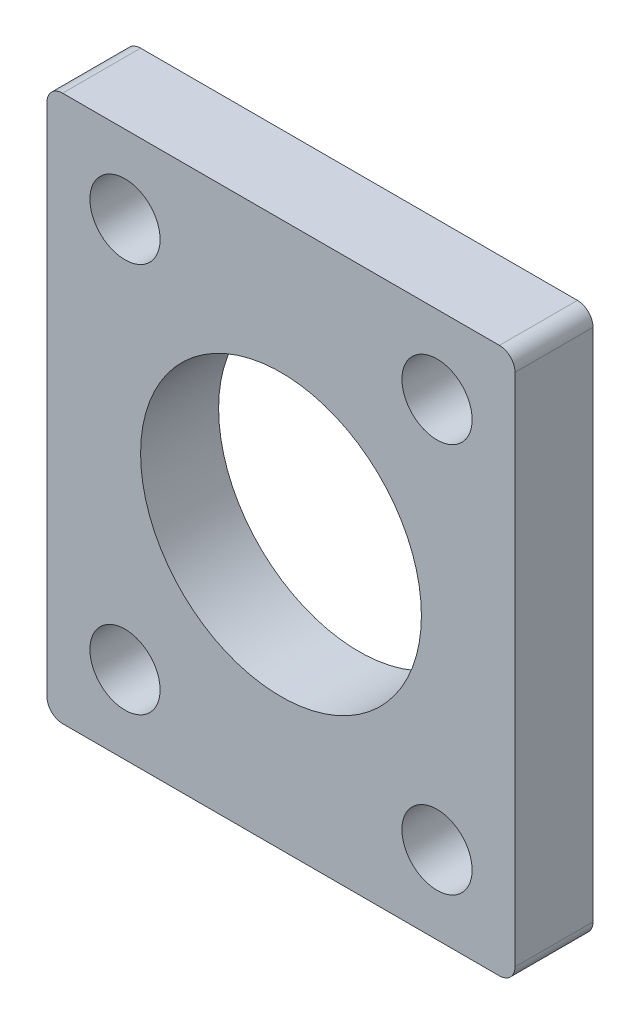
ISO-10303-21;
HEADER;
FILE_DESCRIPTION(('STEP AP214'),'2;1');
FILE_NAME('part.step','',(''),(''),'','','');
FILE_SCHEMA(('AUTOMOTIVE_DESIGN { 1 0 10303 214 1 1 1 1 }'));
ENDSEC;
DATA;
#1=APPLICATION_CONTEXT('core data for automotive mechanical design processes');
#2=APPLICATION_PROTOCOL_DEFINITION('international standard','automotive_design',2000,#1);
#3=PRODUCT_CONTEXT('',#1,'mechanical');
#4=PRODUCT('Part','Part','',(#3));
#5=PRODUCT_RELATED_PRODUCT_CATEGORY('part','',(#4));
#6=PRODUCT_DEFINITION_FORMATION('','',#4);
#7=PRODUCT_DEFINITION_CONTEXT('part definition',#1,'design');
#8=PRODUCT_DEFINITION('design','',#6,#7);
#9=PRODUCT_DEFINITION_SHAPE('','',#8);
#10=(LENGTH_UNIT() NAMED_UNIT(*) SI_UNIT(.MILLI.,.METRE.));
#11=(NAMED_UNIT(*) PLANE_ANGLE_UNIT() SI_UNIT($,.RADIAN.));
#12=(NAMED_UNIT(*) SI_UNIT($,.STERADIAN.) SOLID_ANGLE_UNIT());
#13=UNCERTAINTY_MEASURE_WITH_UNIT(LENGTH_MEASURE(1.E-05),#10,'distance_accuracy_value','');
#14=(GEOMETRIC_REPRESENTATION_CONTEXT(3) GLOBAL_UNCERTAINTY_ASSIGNED_CONTEXT((#13)) GLOBAL_UNIT_ASSIGNED_CONTEXT((#10,
#11,#12)) REPRESENTATION_CONTEXT('',''));
#15=CARTESIAN_POINT('',(0.,0.,0.));
#16=DIRECTION('',(0.,0.,1.));
#17=DIRECTION('',(1.,0.,0.));
#18=AXIS2_PLACEMENT_3D('',#15,#16,#17);
#19=CARTESIAN_POINT('',(0.,-35.,10.));
#20=DIRECTION('',(0.,1.,0.));
#21=DIRECTION('',(-1.,0.,0.));
#22=AXIS2_PLACEMENT_3D('',#19,#20,#21);
#23=PLANE('',#22);
#24=DIRECTION('',(1.,0.,0.));
#25=VECTOR('',#24,1.);
#26=CARTESIAN_POINT('',(0.,-35.,0.));
#27=LINE('',#26,#25);
#28=CARTESIAN_POINT('',(-28.,-35.,0.));
#29=VERTEX_POINT('',#28);
#30=CARTESIAN_POINT('',(28.,-35.,0.));
#31=VERTEX_POINT('',#30);
#32=EDGE_CURVE('E119',#29,#31,#27,.T.);
#33=ORIENTED_EDGE('',*,*,#32,.T.);
#34=DIRECTION('',(0.,0.,-1.));
#35=VECTOR('',#34,1.);
#36=CARTESIAN_POINT('',(28.,-35.,10.));
#37=LINE('',#36,#35);
#38=CARTESIAN_POINT('',(28.,-35.,10.));
#39=VERTEX_POINT('',#38);
#40=EDGE_CURVE('E12',#31,#39,#37,.F.);
#41=ORIENTED_EDGE('',*,*,#40,.T.);
#42=DIRECTION('',(1.,0.,0.));
#43=VECTOR('',#42,1.);
#44=CARTESIAN_POINT('',(0.,-35.,10.));
#45=LINE('',#44,#43);
#46=CARTESIAN_POINT('',(-28.,-35.,10.));
#47=VERTEX_POINT('',#46);
#48=EDGE_CURVE('E194',#47,#39,#45,.T.);
#49=ORIENTED_EDGE('',*,*,#48,.F.);
#50=DIRECTION('',(0.,0.,-1.));
#51=VECTOR('',#50,1.);
#52=CARTESIAN_POINT('',(-28.,-35.,0.));
#53=LINE('',#52,#51);
#54=EDGE_CURVE('E55',#47,#29,#53,.T.);
#55=ORIENTED_EDGE('',*,*,#54,.T.);
#56=EDGE_LOOP('',(#33,#41,#49,#55));
#57=FACE_BOUND('',#56,.T.);
#58=ADVANCED_FACE('F46',(#57),#23,.F.);
#59=CARTESIAN_POINT('',(30.,0.,10.));
#60=DIRECTION('',(-1.,0.,0.));
#61=DIRECTION('',(0.,-1.,0.));
#62=AXIS2_PLACEMENT_3D('',#59,#60,#61);
#63=PLANE('',#62);
#64=DIRECTION('',(0.,1.,0.));
#65=VECTOR('',#64,1.);
#66=CARTESIAN_POINT('',(30.,0.,0.));
#67=LINE('',#66,#65);
#68=CARTESIAN_POINT('',(30.,-33.,0.));
#69=VERTEX_POINT('',#68);
#70=CARTESIAN_POINT('',(30.,33.,0.));
#71=VERTEX_POINT('',#70);
#72=EDGE_CURVE('E209',#69,#71,#67,.T.);
#73=ORIENTED_EDGE('',*,*,#72,.T.);
#74=DIRECTION('',(0.,0.,-1.));
#75=VECTOR('',#74,1.);
#76=CARTESIAN_POINT('',(30.,33.,10.));
#77=LINE('',#76,#75);
#78=CARTESIAN_POINT('',(30.,33.,10.));
#79=VERTEX_POINT('',#78);
#80=EDGE_CURVE('E63',#71,#79,#77,.F.);
#81=ORIENTED_EDGE('',*,*,#80,.T.);
#82=DIRECTION('',(0.,1.,0.));
#83=VECTOR('',#82,1.);
#84=CARTESIAN_POINT('',(30.,0.,10.));
#85=LINE('',#84,#83);
#86=CARTESIAN_POINT('',(30.,-33.,10.));
#87=VERTEX_POINT('',#86);
#88=EDGE_CURVE('E196',#87,#79,#85,.T.);
#89=ORIENTED_EDGE('',*,*,#88,.F.);
#90=DIRECTION('',(0.,0.,-1.));
#91=VECTOR('',#90,1.);
#92=CARTESIAN_POINT('',(30.,-33.,10.));
#93=LINE('',#92,#91);
#94=EDGE_CURVE('E163',#87,#69,#93,.T.);
#95=ORIENTED_EDGE('',*,*,#94,.T.);
#96=EDGE_LOOP('',(#73,#81,#89,#95));
#97=FACE_BOUND('',#96,.T.);
#98=ADVANCED_FACE('F218',(#97),#63,.F.);
#99=CARTESIAN_POINT('',(0.,35.,10.));
#100=DIRECTION('',(0.,1.,0.));
#101=DIRECTION('',(-1.,0.,0.));
#102=AXIS2_PLACEMENT_3D('',#99,#100,#101);
#103=PLANE('',#102);
#104=DIRECTION('',(1.,0.,0.));
#105=VECTOR('',#104,1.);
#106=CARTESIAN_POINT('',(0.,35.,0.));
#107=LINE('',#106,#105);
#108=CARTESIAN_POINT('',(-28.,35.,0.));
#109=VERTEX_POINT('',#108);
#110=CARTESIAN_POINT('',(28.,35.,0.));
#111=VERTEX_POINT('',#110);
#112=EDGE_CURVE('E135',#109,#111,#107,.T.);
#113=ORIENTED_EDGE('',*,*,#112,.F.);
#114=DIRECTION('',(0.,0.,-1.));
#115=VECTOR('',#114,1.);
#116=CARTESIAN_POINT('',(-28.,35.,10.));
#117=LINE('',#116,#115);
#118=CARTESIAN_POINT('',(-28.,35.,10.));
#119=VERTEX_POINT('',#118);
#120=EDGE_CURVE('E155',#109,#119,#117,.F.);
#121=ORIENTED_EDGE('',*,*,#120,.T.);
#122=DIRECTION('',(1.,0.,0.));
#123=VECTOR('',#122,1.);
#124=CARTESIAN_POINT('',(0.,35.,10.));
#125=LINE('',#124,#123);
#126=CARTESIAN_POINT('',(28.,35.,10.));
#127=VERTEX_POINT('',#126);
#128=EDGE_CURVE('E142',#119,#127,#125,.T.);
#129=ORIENTED_EDGE('',*,*,#128,.T.);
#130=DIRECTION('',(0.,0.,-1.));
#131=VECTOR('',#130,1.);
#132=CARTESIAN_POINT('',(28.,35.,0.));
#133=LINE('',#132,#131);
#134=EDGE_CURVE('E152',#127,#111,#133,.T.);
#135=ORIENTED_EDGE('',*,*,#134,.T.);
#136=EDGE_LOOP('',(#113,#121,#129,#135));
#137=FACE_BOUND('',#136,.T.);
#138=ADVANCED_FACE('F225',(#137),#103,.T.);
#139=CARTESIAN_POINT('',(0.,0.,10.));
#140=DIRECTION('',(0.,0.,-1.));
#141=DIRECTION('',(-1.,0.,0.));
#142=AXIS2_PLACEMENT_3D('',#139,#140,#141);
#143=CYLINDRICAL_SURFACE('',#142,18.);
#144=CARTESIAN_POINT('',(0.,0.,10.));
#145=DIRECTION('',(0.,0.,1.));
#146=DIRECTION('',(1.,0.,0.));
#147=AXIS2_PLACEMENT_3D('',#144,#145,#146);
#148=CIRCLE('',#147,18.);
#149=CARTESIAN_POINT('',(18.,0.,10.));
#150=VERTEX_POINT('',#149);
#151=EDGE_CURVE('E134',#150,#150,#148,.T.);
#152=ORIENTED_EDGE('',*,*,#151,.T.);
#153=EDGE_LOOP('',(#152));
#154=FACE_BOUND('',#153,.T.);
#155=CARTESIAN_POINT('',(0.,0.,0.));
#156=DIRECTION('',(0.,0.,1.));
#157=DIRECTION('',(1.,0.,0.));
#158=AXIS2_PLACEMENT_3D('',#155,#156,#157);
#159=CIRCLE('',#158,18.);
#160=CARTESIAN_POINT('',(18.,0.,0.));
#161=VERTEX_POINT('',#160);
#162=EDGE_CURVE('E191',#161,#161,#159,.T.);
#163=ORIENTED_EDGE('',*,*,#162,.F.);
#164=EDGE_LOOP('',(#163));
#165=FACE_BOUND('',#164,.T.);
#166=ADVANCED_FACE('F251',(#154,#165),#143,.F.);
#167=CARTESIAN_POINT('',(-30.,0.,10.));
#168=DIRECTION('',(-1.,0.,0.));
#169=DIRECTION('',(0.,-1.,0.));
#170=AXIS2_PLACEMENT_3D('',#167,#168,#169);
#171=PLANE('',#170);
#172=DIRECTION('',(0.,1.,0.));
#173=VECTOR('',#172,1.);
#174=CARTESIAN_POINT('',(-30.,0.,10.));
#175=LINE('',#174,#173);
#176=CARTESIAN_POINT('',(-30.,-33.,10.));
#177=VERTEX_POINT('',#176);
#178=CARTESIAN_POINT('',(-30.,33.,10.));
#179=VERTEX_POINT('',#178);
#180=EDGE_CURVE('E139',#177,#179,#175,.T.);
#181=ORIENTED_EDGE('',*,*,#180,.T.);
#182=DIRECTION('',(0.,0.,-1.));
#183=VECTOR('',#182,1.);
#184=CARTESIAN_POINT('',(-30.,33.,10.));
#185=LINE('',#184,#183);
#186=CARTESIAN_POINT('',(-30.,33.,0.));
#187=VERTEX_POINT('',#186);
#188=EDGE_CURVE('E125',#179,#187,#185,.T.);
#189=ORIENTED_EDGE('',*,*,#188,.T.);
#190=DIRECTION('',(0.,1.,0.));
#191=VECTOR('',#190,1.);
#192=CARTESIAN_POINT('',(-30.,0.,0.));
#193=LINE('',#192,#191);
#194=CARTESIAN_POINT('',(-30.,-33.,0.));
#195=VERTEX_POINT('',#194);
#196=EDGE_CURVE('E117',#195,#187,#193,.T.);
#197=ORIENTED_EDGE('',*,*,#196,.F.);
#198=DIRECTION('',(0.,0.,-1.));
#199=VECTOR('',#198,1.);
#200=CARTESIAN_POINT('',(-30.,-33.,10.));
#201=LINE('',#200,#199);
#202=EDGE_CURVE('E131',#195,#177,#201,.F.);
#203=ORIENTED_EDGE('',*,*,#202,.T.);
#204=EDGE_LOOP('',(#181,#189,#197,#203));
#205=FACE_BOUND('',#204,.T.);
#206=ADVANCED_FACE('F130',(#205),#171,.T.);
#207=CARTESIAN_POINT('',(0.,0.,10.));
#208=DIRECTION('',(0.,0.,1.));
#209=DIRECTION('',(1.,0.,0.));
#210=AXIS2_PLACEMENT_3D('',#207,#208,#209);
#211=PLANE('',#210);
#212=CARTESIAN_POINT('',(19.9999999999859,25.,9.99999999999999));
#213=DIRECTION('',(0.,0.,1.));
#214=DIRECTION('',(1.,0.,0.));
#215=AXIS2_PLACEMENT_3D('',#212,#213,#214);
#216=CIRCLE('',#215,4.50000000000002);
#217=CARTESIAN_POINT('',(24.4999999999859,25.,9.99999999999999));
#218=VERTEX_POINT('',#217);
#219=EDGE_CURVE('E188',#218,#218,#216,.F.);
#220=ORIENTED_EDGE('',*,*,#219,.T.);
#221=EDGE_LOOP('',(#220));
#222=FACE_BOUND('',#221,.T.);
#223=CARTESIAN_POINT('',(-19.9999999999859,25.,9.99999999999999));
#224=DIRECTION('',(0.,0.,1.));
#225=DIRECTION('',(1.,0.,0.));
#226=AXIS2_PLACEMENT_3D('',#223,#224,#225);
#227=CIRCLE('',#226,4.50000000000002);
#228=CARTESIAN_POINT('',(-15.4999999999859,25.,9.99999999999999));
#229=VERTEX_POINT('',#228);
#230=EDGE_CURVE('E177',#229,#229,#227,.F.);
#231=ORIENTED_EDGE('',*,*,#230,.T.);
#232=EDGE_LOOP('',(#231));
#233=FACE_BOUND('',#232,.T.);
#234=CARTESIAN_POINT('',(-19.9999999999859,-25.,9.99999999999999));
#235=DIRECTION('',(0.,0.,1.));
#236=DIRECTION('',(1.,0.,0.));
#237=AXIS2_PLACEMENT_3D('',#234,#235,#236);
#238=CIRCLE('',#237,4.50000000000002);
#239=CARTESIAN_POINT('',(-15.4999999999859,-25.,9.99999999999999));
#240=VERTEX_POINT('',#239);
#241=EDGE_CURVE('E174',#240,#240,#238,.F.);
#242=ORIENTED_EDGE('',*,*,#241,.T.);
#243=EDGE_LOOP('',(#242));
#244=FACE_BOUND('',#243,.T.);
#245=CARTESIAN_POINT('',(19.9999999999859,-25.,9.99999999999999));
#246=DIRECTION('',(0.,0.,1.));
#247=DIRECTION('',(1.,0.,0.));
#248=AXIS2_PLACEMENT_3D('',#245,#246,#247);
#249=CIRCLE('',#248,4.50000000000002);
#250=CARTESIAN_POINT('',(24.4999999999859,-25.,9.99999999999999));
#251=VERTEX_POINT('',#250);
#252=EDGE_CURVE('E171',#251,#251,#249,.F.);
#253=ORIENTED_EDGE('',*,*,#252,.T.);
#254=EDGE_LOOP('',(#253));
#255=FACE_BOUND('',#254,.T.);
#256=ORIENTED_EDGE('',*,*,#151,.F.);
#257=EDGE_LOOP('',(#256));
#258=FACE_BOUND('',#257,.T.);
#259=ORIENTED_EDGE('',*,*,#128,.F.);
#260=CARTESIAN_POINT('',(-28.,33.,10.));
#261=DIRECTION('',(0.,0.,1.));
#262=DIRECTION('',(1.,0.,0.));
#263=AXIS2_PLACEMENT_3D('',#260,#261,#262);
#264=CIRCLE('',#263,2.);
#265=EDGE_CURVE('E161',#119,#179,#264,.T.);
#266=ORIENTED_EDGE('',*,*,#265,.T.);
#267=ORIENTED_EDGE('',*,*,#180,.F.);
#268=CARTESIAN_POINT('',(-28.,-33.,10.));
#269=DIRECTION('',(0.,0.,1.));
#270=DIRECTION('',(1.,0.,0.));
#271=AXIS2_PLACEMENT_3D('',#268,#269,#270);
#272=CIRCLE('',#271,2.);
#273=EDGE_CURVE('E138',#177,#47,#272,.T.);
#274=ORIENTED_EDGE('',*,*,#273,.T.);
#275=ORIENTED_EDGE('',*,*,#48,.T.);
#276=CARTESIAN_POINT('',(28.,-33.,10.));
#277=DIRECTION('',(0.,0.,1.));
#278=DIRECTION('',(1.,0.,0.));
#279=AXIS2_PLACEMENT_3D('',#276,#277,#278);
#280=CIRCLE('',#279,2.);
#281=EDGE_CURVE('E70',#39,#87,#280,.T.);
#282=ORIENTED_EDGE('',*,*,#281,.T.);
#283=ORIENTED_EDGE('',*,*,#88,.T.);
#284=CARTESIAN_POINT('',(28.,33.,10.));
#285=DIRECTION('',(0.,0.,1.));
#286=DIRECTION('',(1.,0.,0.));
#287=AXIS2_PLACEMENT_3D('',#284,#285,#286);
#288=CIRCLE('',#287,2.);
#289=EDGE_CURVE('E159',#79,#127,#288,.T.);
#290=ORIENTED_EDGE('',*,*,#289,.T.);
#291=EDGE_LOOP('',(#259,#266,#267,#274,#275,#282,#283,#290));
#292=FACE_BOUND('',#291,.T.);
#293=ADVANCED_FACE('F229',(#222,#233,#244,#255,#258,#292),#211,.T.);
#294=CARTESIAN_POINT('',(0.,0.,0.));
#295=DIRECTION('',(0.,0.,1.));
#296=DIRECTION('',(1.,0.,0.));
#297=AXIS2_PLACEMENT_3D('',#294,#295,#296);
#298=PLANE('',#297);
#299=CARTESIAN_POINT('',(19.9999999999859,25.,0.));
#300=DIRECTION('',(0.,0.,1.));
#301=DIRECTION('',(1.,0.,0.));
#302=AXIS2_PLACEMENT_3D('',#299,#300,#301);
#303=CIRCLE('',#302,4.50000000000002);
#304=CARTESIAN_POINT('',(24.4999999999859,25.,0.));
#305=VERTEX_POINT('',#304);
#306=EDGE_CURVE('E50',#305,#305,#303,.F.);
#307=ORIENTED_EDGE('',*,*,#306,.F.);
#308=EDGE_LOOP('',(#307));
#309=FACE_BOUND('',#308,.T.);
#310=CARTESIAN_POINT('',(-19.9999999999859,25.,0.));
#311=DIRECTION('',(0.,0.,1.));
#312=DIRECTION('',(1.,0.,0.));
#313=AXIS2_PLACEMENT_3D('',#310,#311,#312);
#314=CIRCLE('',#313,4.50000000000002);
#315=CARTESIAN_POINT('',(-15.4999999999859,25.,0.));
#316=VERTEX_POINT('',#315);
#317=EDGE_CURVE('E175',#316,#316,#314,.F.);
#318=ORIENTED_EDGE('',*,*,#317,.F.);
#319=EDGE_LOOP('',(#318));
#320=FACE_BOUND('',#319,.T.);
#321=CARTESIAN_POINT('',(-19.9999999999859,-25.,0.));
#322=DIRECTION('',(0.,0.,1.));
#323=DIRECTION('',(1.,0.,0.));
#324=AXIS2_PLACEMENT_3D('',#321,#322,#323);
#325=CIRCLE('',#324,4.50000000000002);
#326=CARTESIAN_POINT('',(-15.4999999999859,-25.,0.));
#327=VERTEX_POINT('',#326);
#328=EDGE_CURVE('E172',#327,#327,#325,.F.);
#329=ORIENTED_EDGE('',*,*,#328,.F.);
#330=EDGE_LOOP('',(#329));
#331=FACE_BOUND('',#330,.T.);
#332=CARTESIAN_POINT('',(19.9999999999859,-25.,0.));
#333=DIRECTION('',(0.,0.,1.));
#334=DIRECTION('',(1.,0.,0.));
#335=AXIS2_PLACEMENT_3D('',#332,#333,#334);
#336=CIRCLE('',#335,4.50000000000002);
#337=CARTESIAN_POINT('',(24.4999999999859,-25.,0.));
#338=VERTEX_POINT('',#337);
#339=EDGE_CURVE('E168',#338,#338,#336,.F.);
#340=ORIENTED_EDGE('',*,*,#339,.F.);
#341=EDGE_LOOP('',(#340));
#342=FACE_BOUND('',#341,.T.);
#343=ORIENTED_EDGE('',*,*,#162,.T.);
#344=EDGE_LOOP('',(#343));
#345=FACE_BOUND('',#344,.T.);
#346=ORIENTED_EDGE('',*,*,#196,.T.);
#347=CARTESIAN_POINT('',(-28.,33.,0.));
#348=DIRECTION('',(0.,0.,1.));
#349=DIRECTION('',(1.,0.,0.));
#350=AXIS2_PLACEMENT_3D('',#347,#348,#349);
#351=CIRCLE('',#350,2.);
#352=EDGE_CURVE('E150',#187,#109,#351,.F.);
#353=ORIENTED_EDGE('',*,*,#352,.T.);
#354=ORIENTED_EDGE('',*,*,#112,.T.);
#355=CARTESIAN_POINT('',(28.,33.,0.));
#356=DIRECTION('',(0.,0.,1.));
#357=DIRECTION('',(1.,0.,0.));
#358=AXIS2_PLACEMENT_3D('',#355,#356,#357);
#359=CIRCLE('',#358,2.);
#360=EDGE_CURVE('E148',#111,#71,#359,.F.);
#361=ORIENTED_EDGE('',*,*,#360,.T.);
#362=ORIENTED_EDGE('',*,*,#72,.F.);
#363=CARTESIAN_POINT('',(28.,-33.,0.));
#364=DIRECTION('',(0.,0.,1.));
#365=DIRECTION('',(1.,0.,0.));
#366=AXIS2_PLACEMENT_3D('',#363,#364,#365);
#367=CIRCLE('',#366,2.);
#368=EDGE_CURVE('E124',#69,#31,#367,.F.);
#369=ORIENTED_EDGE('',*,*,#368,.T.);
#370=ORIENTED_EDGE('',*,*,#32,.F.);
#371=CARTESIAN_POINT('',(-28.,-33.,0.));
#372=DIRECTION('',(0.,0.,1.));
#373=DIRECTION('',(1.,0.,0.));
#374=AXIS2_PLACEMENT_3D('',#371,#372,#373);
#375=CIRCLE('',#374,2.);
#376=EDGE_CURVE('E114',#29,#195,#375,.F.);
#377=ORIENTED_EDGE('',*,*,#376,.T.);
#378=EDGE_LOOP('',(#346,#353,#354,#361,#362,#369,#370,#377));
#379=FACE_BOUND('',#378,.T.);
#380=ADVANCED_FACE('F116',(#309,#320,#331,#342,#345,#379),#298,.F.);
#381=CARTESIAN_POINT('',(-28.,33.,10.));
#382=DIRECTION('',(0.,0.,-1.));
#383=DIRECTION('',(-1.,0.,0.));
#384=AXIS2_PLACEMENT_3D('',#381,#382,#383);
#385=CYLINDRICAL_SURFACE('',#384,2.);
#386=ORIENTED_EDGE('',*,*,#265,.F.);
#387=ORIENTED_EDGE('',*,*,#120,.F.);
#388=ORIENTED_EDGE('',*,*,#352,.F.);
#389=ORIENTED_EDGE('',*,*,#188,.F.);
#390=EDGE_LOOP('',(#386,#387,#388,#389));
#391=FACE_BOUND('',#390,.T.);
#392=ADVANCED_FACE('F231',(#391),#385,.T.);
#393=CARTESIAN_POINT('',(28.,33.,10.));
#394=DIRECTION('',(0.,0.,1.));
#395=DIRECTION('',(1.,0.,0.));
#396=AXIS2_PLACEMENT_3D('',#393,#394,#395);
#397=CYLINDRICAL_SURFACE('',#396,2.);
#398=ORIENTED_EDGE('',*,*,#289,.F.);
#399=ORIENTED_EDGE('',*,*,#80,.F.);
#400=ORIENTED_EDGE('',*,*,#360,.F.);
#401=ORIENTED_EDGE('',*,*,#134,.F.);
#402=EDGE_LOOP('',(#398,#399,#400,#401));
#403=FACE_BOUND('',#402,.T.);
#404=ADVANCED_FACE('F223',(#403),#397,.T.);
#405=CARTESIAN_POINT('',(28.,-33.,10.));
#406=DIRECTION('',(0.,0.,-1.));
#407=DIRECTION('',(-1.,0.,0.));
#408=AXIS2_PLACEMENT_3D('',#405,#406,#407);
#409=CYLINDRICAL_SURFACE('',#408,2.);
#410=ORIENTED_EDGE('',*,*,#281,.F.);
#411=ORIENTED_EDGE('',*,*,#40,.F.);
#412=ORIENTED_EDGE('',*,*,#368,.F.);
#413=ORIENTED_EDGE('',*,*,#94,.F.);
#414=EDGE_LOOP('',(#410,#411,#412,#413));
#415=FACE_BOUND('',#414,.T.);
#416=ADVANCED_FACE('F216',(#415),#409,.T.);
#417=CARTESIAN_POINT('',(-28.,-33.,10.));
#418=DIRECTION('',(0.,0.,1.));
#419=DIRECTION('',(1.,0.,0.));
#420=AXIS2_PLACEMENT_3D('',#417,#418,#419);
#421=CYLINDRICAL_SURFACE('',#420,2.);
#422=ORIENTED_EDGE('',*,*,#273,.F.);
#423=ORIENTED_EDGE('',*,*,#202,.F.);
#424=ORIENTED_EDGE('',*,*,#376,.F.);
#425=ORIENTED_EDGE('',*,*,#54,.F.);
#426=EDGE_LOOP('',(#422,#423,#424,#425));
#427=FACE_BOUND('',#426,.T.);
#428=ADVANCED_FACE('F48',(#427),#421,.T.);
#429=CARTESIAN_POINT('',(19.9999999999859,-25.0000000000003,-89.0000000000009));
#430=DIRECTION('',(0.,0.,1.));
#431=DIRECTION('',(0.,-1.,0.));
#432=AXIS2_PLACEMENT_3D('',#429,#430,#431);
#433=CYLINDRICAL_SURFACE('',#432,4.50000000000002);
#434=ORIENTED_EDGE('',*,*,#252,.F.);
#435=EDGE_LOOP('',(#434));
#436=FACE_BOUND('',#435,.T.);
#437=ORIENTED_EDGE('',*,*,#339,.T.);
#438=EDGE_LOOP('',(#437));
#439=FACE_BOUND('',#438,.T.);
#440=ADVANCED_FACE('F270',(#436,#439),#433,.F.);
#441=CARTESIAN_POINT('',(-19.9999999999859,-25.0000000000003,-89.0000000000009));
#442=DIRECTION('',(0.,0.,1.));
#443=DIRECTION('',(0.,-1.,0.));
#444=AXIS2_PLACEMENT_3D('',#441,#442,#443);
#445=CYLINDRICAL_SURFACE('',#444,4.50000000000002);
#446=ORIENTED_EDGE('',*,*,#241,.F.);
#447=EDGE_LOOP('',(#446));
#448=FACE_BOUND('',#447,.T.);
#449=ORIENTED_EDGE('',*,*,#328,.T.);
#450=EDGE_LOOP('',(#449));
#451=FACE_BOUND('',#450,.T.);
#452=ADVANCED_FACE('F273',(#448,#451),#445,.F.);
#453=CARTESIAN_POINT('',(-19.9999999999859,24.9999999999997,-89.0000000000011));
#454=DIRECTION('',(0.,0.,1.));
#455=DIRECTION('',(0.,-1.,0.));
#456=AXIS2_PLACEMENT_3D('',#453,#454,#455);
#457=CYLINDRICAL_SURFACE('',#456,4.50000000000002);
#458=ORIENTED_EDGE('',*,*,#230,.F.);
#459=EDGE_LOOP('',(#458));
#460=FACE_BOUND('',#459,.T.);
#461=ORIENTED_EDGE('',*,*,#317,.T.);
#462=EDGE_LOOP('',(#461));
#463=FACE_BOUND('',#462,.T.);
#464=ADVANCED_FACE('F278',(#460,#463),#457,.F.);
#465=CARTESIAN_POINT('',(19.9999999999859,24.9999999999997,-89.0000000000011));
#466=DIRECTION('',(0.,0.,1.));
#467=DIRECTION('',(0.,-1.,0.));
#468=AXIS2_PLACEMENT_3D('',#465,#466,#467);
#469=CYLINDRICAL_SURFACE('',#468,4.50000000000002);
#470=ORIENTED_EDGE('',*,*,#219,.F.);
#471=EDGE_LOOP('',(#470));
#472=FACE_BOUND('',#471,.T.);
#473=ORIENTED_EDGE('',*,*,#306,.T.);
#474=EDGE_LOOP('',(#473));
#475=FACE_BOUND('',#474,.T.);
#476=ADVANCED_FACE('F275',(#472,#475),#469,.F.);
#477=CLOSED_SHELL('',(#58,#98,#138,#166,#206,#293,#380,#392,#404,#416,#428,#440,#452,#464,#476));
#478=MANIFOLD_SOLID_BREP('B2',#477);
#479=ADVANCED_BREP_SHAPE_REPRESENTATION('',(#18,#478),#14);
#480=SHAPE_DEFINITION_REPRESENTATION(#9,#479);
ENDSEC;
END-ISO-10303-21;
